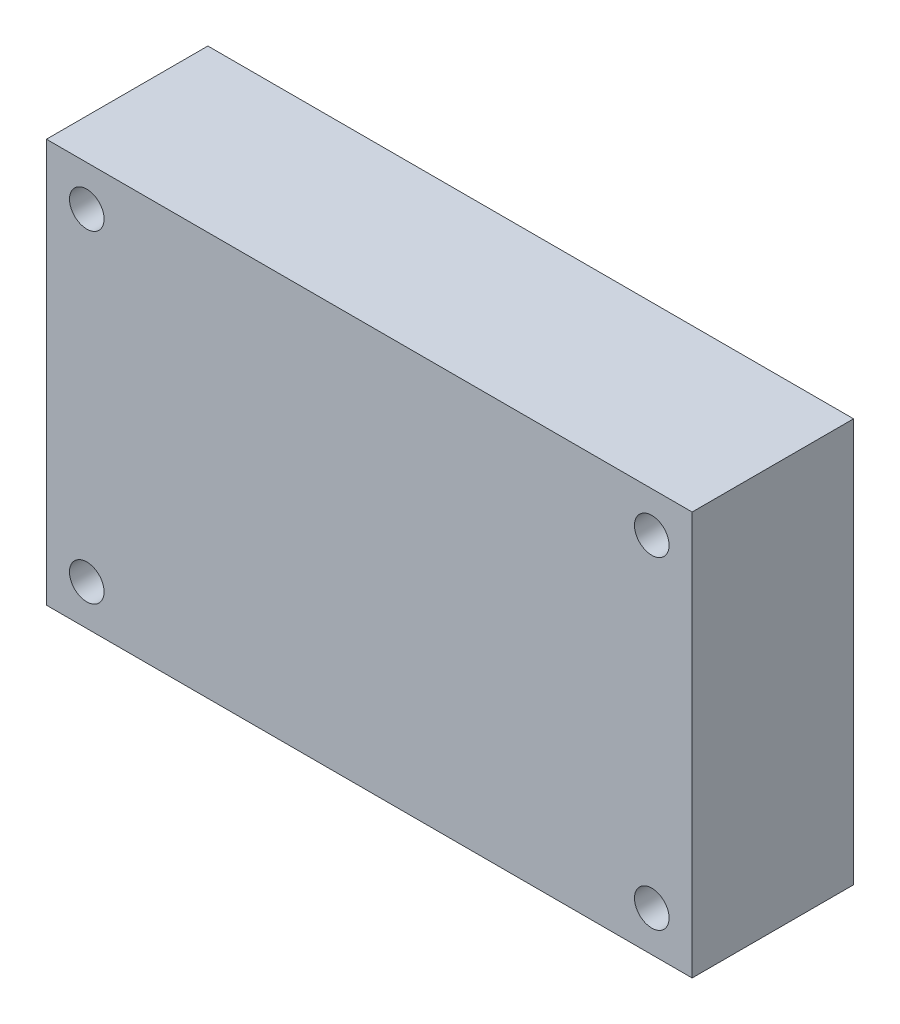
ISO-10303-21;
HEADER;
FILE_DESCRIPTION(('STEP AP214'),'2;1');
FILE_NAME('part.step','',(''),(''),'','','');
FILE_SCHEMA(('AUTOMOTIVE_DESIGN { 1 0 10303 214 1 1 1 1 }'));
ENDSEC;
DATA;
#1=APPLICATION_CONTEXT('core data for automotive mechanical design processes');
#2=APPLICATION_PROTOCOL_DEFINITION('international standard','automotive_design',2000,#1);
#3=PRODUCT_CONTEXT('',#1,'mechanical');
#4=PRODUCT('Part','Part','',(#3));
#5=PRODUCT_RELATED_PRODUCT_CATEGORY('part','',(#4));
#6=PRODUCT_DEFINITION_FORMATION('','',#4);
#7=PRODUCT_DEFINITION_CONTEXT('part definition',#1,'design');
#8=PRODUCT_DEFINITION('design','',#6,#7);
#9=PRODUCT_DEFINITION_SHAPE('','',#8);
#10=(LENGTH_UNIT() NAMED_UNIT(*) SI_UNIT(.MILLI.,.METRE.));
#11=(NAMED_UNIT(*) PLANE_ANGLE_UNIT() SI_UNIT($,.RADIAN.));
#12=(NAMED_UNIT(*) SI_UNIT($,.STERADIAN.) SOLID_ANGLE_UNIT());
#13=UNCERTAINTY_MEASURE_WITH_UNIT(LENGTH_MEASURE(1.E-05),#10,'distance_accuracy_value','');
#14=(GEOMETRIC_REPRESENTATION_CONTEXT(3) GLOBAL_UNCERTAINTY_ASSIGNED_CONTEXT((#13)) GLOBAL_UNIT_ASSIGNED_CONTEXT((#10,
#11,#12)) REPRESENTATION_CONTEXT('',''));
#15=CARTESIAN_POINT('',(0.,0.,0.));
#16=DIRECTION('',(0.,0.,1.));
#17=DIRECTION('',(1.,0.,0.));
#18=AXIS2_PLACEMENT_3D('',#15,#16,#17);
#19=CARTESIAN_POINT('',(0.,0.,14.));
#20=DIRECTION('',(1.,0.,0.));
#21=DIRECTION('',(0.,0.,-1.));
#22=AXIS2_PLACEMENT_3D('',#19,#20,#21);
#23=PLANE('',#22);
#24=DIRECTION('',(0.,-1.,0.));
#25=VECTOR('',#24,1.);
#26=CARTESIAN_POINT('',(0.,0.,0.));
#27=LINE('',#26,#25);
#28=CARTESIAN_POINT('',(0.,35.,0.));
#29=VERTEX_POINT('',#28);
#30=CARTESIAN_POINT('',(0.,0.,0.));
#31=VERTEX_POINT('',#30);
#32=EDGE_CURVE('E100',#29,#31,#27,.T.);
#33=ORIENTED_EDGE('',*,*,#32,.T.);
#34=DIRECTION('',(0.,0.,-1.));
#35=VECTOR('',#34,1.);
#36=CARTESIAN_POINT('',(0.,0.,14.));
#37=LINE('',#36,#35);
#38=CARTESIAN_POINT('',(0.,0.,14.));
#39=VERTEX_POINT('',#38);
#40=EDGE_CURVE('E11',#39,#31,#37,.T.);
#41=ORIENTED_EDGE('',*,*,#40,.F.);
#42=DIRECTION('',(0.,-1.,0.));
#43=VECTOR('',#42,1.);
#44=CARTESIAN_POINT('',(0.,0.,14.));
#45=LINE('',#44,#43);
#46=CARTESIAN_POINT('',(0.,35.,14.));
#47=VERTEX_POINT('',#46);
#48=EDGE_CURVE('E88',#47,#39,#45,.T.);
#49=ORIENTED_EDGE('',*,*,#48,.F.);
#50=DIRECTION('',(0.,0.,-1.));
#51=VECTOR('',#50,1.);
#52=CARTESIAN_POINT('',(0.,35.,14.));
#53=LINE('',#52,#51);
#54=EDGE_CURVE('E96',#47,#29,#53,.T.);
#55=ORIENTED_EDGE('',*,*,#54,.T.);
#56=EDGE_LOOP('',(#33,#41,#49,#55));
#57=FACE_BOUND('',#56,.T.);
#58=ADVANCED_FACE('F37',(#57),#23,.F.);
#59=CARTESIAN_POINT('',(0.,0.,14.));
#60=DIRECTION('',(0.,1.,0.));
#61=DIRECTION('',(0.,0.,1.));
#62=AXIS2_PLACEMENT_3D('',#59,#60,#61);
#63=PLANE('',#62);
#64=DIRECTION('',(1.,0.,0.));
#65=VECTOR('',#64,1.);
#66=CARTESIAN_POINT('',(0.,0.,0.));
#67=LINE('',#66,#65);
#68=CARTESIAN_POINT('',(56.,0.,0.));
#69=VERTEX_POINT('',#68);
#70=EDGE_CURVE('E92',#31,#69,#67,.T.);
#71=ORIENTED_EDGE('',*,*,#70,.T.);
#72=DIRECTION('',(0.,0.,-1.));
#73=VECTOR('',#72,1.);
#74=CARTESIAN_POINT('',(56.,0.,14.));
#75=LINE('',#74,#73);
#76=CARTESIAN_POINT('',(56.,0.,14.));
#77=VERTEX_POINT('',#76);
#78=EDGE_CURVE('E45',#77,#69,#75,.T.);
#79=ORIENTED_EDGE('',*,*,#78,.F.);
#80=DIRECTION('',(1.,0.,0.));
#81=VECTOR('',#80,1.);
#82=CARTESIAN_POINT('',(0.,0.,14.));
#83=LINE('',#82,#81);
#84=EDGE_CURVE('E83',#39,#77,#83,.T.);
#85=ORIENTED_EDGE('',*,*,#84,.F.);
#86=ORIENTED_EDGE('',*,*,#40,.T.);
#87=EDGE_LOOP('',(#71,#79,#85,#86));
#88=FACE_BOUND('',#87,.T.);
#89=ADVANCED_FACE('F91',(#88),#63,.F.);
#90=CARTESIAN_POINT('',(56.,0.,14.));
#91=DIRECTION('',(-1.,0.,0.));
#92=DIRECTION('',(0.,0.,1.));
#93=AXIS2_PLACEMENT_3D('',#90,#91,#92);
#94=PLANE('',#93);
#95=DIRECTION('',(0.,1.,0.));
#96=VECTOR('',#95,1.);
#97=CARTESIAN_POINT('',(56.,0.,0.));
#98=LINE('',#97,#96);
#99=CARTESIAN_POINT('',(56.,35.,0.));
#100=VERTEX_POINT('',#99);
#101=EDGE_CURVE('E70',#69,#100,#98,.T.);
#102=ORIENTED_EDGE('',*,*,#101,.T.);
#103=DIRECTION('',(0.,0.,-1.));
#104=VECTOR('',#103,1.);
#105=CARTESIAN_POINT('',(56.,35.,14.));
#106=LINE('',#105,#104);
#107=CARTESIAN_POINT('',(56.,35.,14.));
#108=VERTEX_POINT('',#107);
#109=EDGE_CURVE('E93',#108,#100,#106,.T.);
#110=ORIENTED_EDGE('',*,*,#109,.F.);
#111=DIRECTION('',(0.,1.,0.));
#112=VECTOR('',#111,1.);
#113=CARTESIAN_POINT('',(56.,0.,14.));
#114=LINE('',#113,#112);
#115=EDGE_CURVE('E86',#77,#108,#114,.T.);
#116=ORIENTED_EDGE('',*,*,#115,.F.);
#117=ORIENTED_EDGE('',*,*,#78,.T.);
#118=EDGE_LOOP('',(#102,#110,#116,#117));
#119=FACE_BOUND('',#118,.T.);
#120=ADVANCED_FACE('F94',(#119),#94,.F.);
#121=CARTESIAN_POINT('',(0.,35.,14.));
#122=DIRECTION('',(0.,-1.,0.));
#123=DIRECTION('',(0.,0.,-1.));
#124=AXIS2_PLACEMENT_3D('',#121,#122,#123);
#125=PLANE('',#124);
#126=DIRECTION('',(-1.,0.,0.));
#127=VECTOR('',#126,1.);
#128=CARTESIAN_POINT('',(0.,35.,0.));
#129=LINE('',#128,#127);
#130=EDGE_CURVE('E76',#100,#29,#129,.T.);
#131=ORIENTED_EDGE('',*,*,#130,.T.);
#132=ORIENTED_EDGE('',*,*,#54,.F.);
#133=DIRECTION('',(-1.,0.,0.));
#134=VECTOR('',#133,1.);
#135=CARTESIAN_POINT('',(0.,35.,14.));
#136=LINE('',#135,#134);
#137=EDGE_CURVE('E53',#108,#47,#136,.T.);
#138=ORIENTED_EDGE('',*,*,#137,.F.);
#139=ORIENTED_EDGE('',*,*,#109,.T.);
#140=EDGE_LOOP('',(#131,#132,#138,#139));
#141=FACE_BOUND('',#140,.T.);
#142=ADVANCED_FACE('F108',(#141),#125,.F.);
#143=CARTESIAN_POINT('',(0.,0.,14.));
#144=DIRECTION('',(0.,0.,-1.));
#145=DIRECTION('',(-1.,0.,0.));
#146=AXIS2_PLACEMENT_3D('',#143,#144,#145);
#147=PLANE('',#146);
#148=CARTESIAN_POINT('',(3.5,3.5,14.));
#149=DIRECTION('',(0.,0.,1.));
#150=DIRECTION('',(1.,0.,0.));
#151=AXIS2_PLACEMENT_3D('',#148,#149,#150);
#152=CIRCLE('',#151,1.5);
#153=CARTESIAN_POINT('',(5.,3.5,14.));
#154=VERTEX_POINT('',#153);
#155=EDGE_CURVE('E127',#154,#154,#152,.T.);
#156=ORIENTED_EDGE('',*,*,#155,.F.);
#157=EDGE_LOOP('',(#156));
#158=FACE_BOUND('',#157,.T.);
#159=CARTESIAN_POINT('',(52.5,31.5,14.));
#160=DIRECTION('',(0.,0.,1.));
#161=DIRECTION('',(1.,0.,0.));
#162=AXIS2_PLACEMENT_3D('',#159,#160,#161);
#163=CIRCLE('',#162,1.5);
#164=CARTESIAN_POINT('',(54.,31.5,14.));
#165=VERTEX_POINT('',#164);
#166=EDGE_CURVE('E120',#165,#165,#163,.T.);
#167=ORIENTED_EDGE('',*,*,#166,.F.);
#168=EDGE_LOOP('',(#167));
#169=FACE_BOUND('',#168,.T.);
#170=CARTESIAN_POINT('',(52.5,3.5,14.));
#171=DIRECTION('',(0.,0.,1.));
#172=DIRECTION('',(1.,0.,0.));
#173=AXIS2_PLACEMENT_3D('',#170,#171,#172);
#174=CIRCLE('',#173,1.5);
#175=CARTESIAN_POINT('',(54.,3.5,14.));
#176=VERTEX_POINT('',#175);
#177=EDGE_CURVE('E132',#176,#176,#174,.T.);
#178=ORIENTED_EDGE('',*,*,#177,.F.);
#179=EDGE_LOOP('',(#178));
#180=FACE_BOUND('',#179,.T.);
#181=CARTESIAN_POINT('',(3.5,31.5,14.));
#182=DIRECTION('',(0.,0.,1.));
#183=DIRECTION('',(1.,0.,0.));
#184=AXIS2_PLACEMENT_3D('',#181,#182,#183);
#185=CIRCLE('',#184,1.5);
#186=CARTESIAN_POINT('',(5.,31.5,14.));
#187=VERTEX_POINT('',#186);
#188=EDGE_CURVE('E114',#187,#187,#185,.T.);
#189=ORIENTED_EDGE('',*,*,#188,.F.);
#190=EDGE_LOOP('',(#189));
#191=FACE_BOUND('',#190,.T.);
#192=ORIENTED_EDGE('',*,*,#48,.T.);
#193=ORIENTED_EDGE('',*,*,#84,.T.);
#194=ORIENTED_EDGE('',*,*,#115,.T.);
#195=ORIENTED_EDGE('',*,*,#137,.T.);
#196=EDGE_LOOP('',(#192,#193,#194,#195));
#197=FACE_BOUND('',#196,.T.);
#198=ADVANCED_FACE('F84',(#158,#169,#180,#191,#197),#147,.F.);
#199=CARTESIAN_POINT('',(0.,0.,0.));
#200=DIRECTION('',(0.,0.,-1.));
#201=DIRECTION('',(-1.,0.,0.));
#202=AXIS2_PLACEMENT_3D('',#199,#200,#201);
#203=PLANE('',#202);
#204=ORIENTED_EDGE('',*,*,#32,.F.);
#205=ORIENTED_EDGE('',*,*,#130,.F.);
#206=ORIENTED_EDGE('',*,*,#101,.F.);
#207=ORIENTED_EDGE('',*,*,#70,.F.);
#208=EDGE_LOOP('',(#204,#205,#206,#207));
#209=FACE_BOUND('',#208,.T.);
#210=ADVANCED_FACE('F111',(#209),#203,.T.);
#211=CARTESIAN_POINT('',(3.5,31.5,4.));
#212=DIRECTION('',(0.,0.,1.));
#213=DIRECTION('',(1.,0.,0.));
#214=AXIS2_PLACEMENT_3D('',#211,#212,#213);
#215=CYLINDRICAL_SURFACE('',#214,1.5);
#216=CARTESIAN_POINT('',(3.5,31.5,4.));
#217=DIRECTION('',(0.,0.,1.));
#218=DIRECTION('',(1.,0.,0.));
#219=AXIS2_PLACEMENT_3D('',#216,#217,#218);
#220=CIRCLE('',#219,1.5);
#221=CARTESIAN_POINT('',(5.,31.5,4.));
#222=VERTEX_POINT('',#221);
#223=EDGE_CURVE('E103',#222,#222,#220,.T.);
#224=ORIENTED_EDGE('',*,*,#223,.F.);
#225=EDGE_LOOP('',(#224));
#226=FACE_BOUND('',#225,.T.);
#227=ORIENTED_EDGE('',*,*,#188,.T.);
#228=EDGE_LOOP('',(#227));
#229=FACE_BOUND('',#228,.T.);
#230=ADVANCED_FACE('F153',(#226,#229),#215,.F.);
#231=CARTESIAN_POINT('',(3.5,31.5,4.));
#232=DIRECTION('',(0.,0.,1.));
#233=DIRECTION('',(1.,0.,0.));
#234=AXIS2_PLACEMENT_3D('',#231,#232,#233);
#235=PLANE('',#234);
#236=ORIENTED_EDGE('',*,*,#223,.T.);
#237=EDGE_LOOP('',(#236));
#238=FACE_BOUND('',#237,.T.);
#239=ADVANCED_FACE('F143',(#238),#235,.T.);
#240=CARTESIAN_POINT('',(52.5,3.5,4.));
#241=DIRECTION('',(0.,0.,1.));
#242=DIRECTION('',(1.,0.,0.));
#243=AXIS2_PLACEMENT_3D('',#240,#241,#242);
#244=CYLINDRICAL_SURFACE('',#243,1.5);
#245=CARTESIAN_POINT('',(52.5,3.5,4.));
#246=DIRECTION('',(0.,0.,1.));
#247=DIRECTION('',(1.,0.,0.));
#248=AXIS2_PLACEMENT_3D('',#245,#246,#247);
#249=CIRCLE('',#248,1.5);
#250=CARTESIAN_POINT('',(54.,3.5,4.));
#251=VERTEX_POINT('',#250);
#252=EDGE_CURVE('E124',#251,#251,#249,.T.);
#253=ORIENTED_EDGE('',*,*,#252,.F.);
#254=EDGE_LOOP('',(#253));
#255=FACE_BOUND('',#254,.T.);
#256=ORIENTED_EDGE('',*,*,#177,.T.);
#257=EDGE_LOOP('',(#256));
#258=FACE_BOUND('',#257,.T.);
#259=ADVANCED_FACE('F140',(#255,#258),#244,.F.);
#260=CARTESIAN_POINT('',(52.5,3.5,4.));
#261=DIRECTION('',(0.,0.,1.));
#262=DIRECTION('',(1.,0.,0.));
#263=AXIS2_PLACEMENT_3D('',#260,#261,#262);
#264=PLANE('',#263);
#265=ORIENTED_EDGE('',*,*,#252,.T.);
#266=EDGE_LOOP('',(#265));
#267=FACE_BOUND('',#266,.T.);
#268=ADVANCED_FACE('F138',(#267),#264,.T.);
#269=CARTESIAN_POINT('',(52.5,31.5,4.));
#270=DIRECTION('',(0.,0.,1.));
#271=DIRECTION('',(1.,0.,0.));
#272=AXIS2_PLACEMENT_3D('',#269,#270,#271);
#273=CYLINDRICAL_SURFACE('',#272,1.5);
#274=CARTESIAN_POINT('',(52.5,31.5,4.));
#275=DIRECTION('',(0.,0.,1.));
#276=DIRECTION('',(1.,0.,0.));
#277=AXIS2_PLACEMENT_3D('',#274,#275,#276);
#278=CIRCLE('',#277,1.5);
#279=CARTESIAN_POINT('',(54.,31.5,4.));
#280=VERTEX_POINT('',#279);
#281=EDGE_CURVE('E123',#280,#280,#278,.T.);
#282=ORIENTED_EDGE('',*,*,#281,.F.);
#283=EDGE_LOOP('',(#282));
#284=FACE_BOUND('',#283,.T.);
#285=ORIENTED_EDGE('',*,*,#166,.T.);
#286=EDGE_LOOP('',(#285));
#287=FACE_BOUND('',#286,.T.);
#288=ADVANCED_FACE('F213',(#284,#287),#273,.F.);
#289=CARTESIAN_POINT('',(52.5,31.5,4.));
#290=DIRECTION('',(0.,0.,1.));
#291=DIRECTION('',(1.,0.,0.));
#292=AXIS2_PLACEMENT_3D('',#289,#290,#291);
#293=PLANE('',#292);
#294=ORIENTED_EDGE('',*,*,#281,.T.);
#295=EDGE_LOOP('',(#294));
#296=FACE_BOUND('',#295,.T.);
#297=ADVANCED_FACE('F221',(#296),#293,.T.);
#298=CARTESIAN_POINT('',(3.5,3.5,4.));
#299=DIRECTION('',(0.,0.,1.));
#300=DIRECTION('',(1.,0.,0.));
#301=AXIS2_PLACEMENT_3D('',#298,#299,#300);
#302=CYLINDRICAL_SURFACE('',#301,1.5);
#303=CARTESIAN_POINT('',(3.5,3.5,4.));
#304=DIRECTION('',(0.,0.,1.));
#305=DIRECTION('',(1.,0.,0.));
#306=AXIS2_PLACEMENT_3D('',#303,#304,#305);
#307=CIRCLE('',#306,1.5);
#308=CARTESIAN_POINT('',(5.,3.5,4.));
#309=VERTEX_POINT('',#308);
#310=EDGE_CURVE('E117',#309,#309,#307,.T.);
#311=ORIENTED_EDGE('',*,*,#310,.F.);
#312=EDGE_LOOP('',(#311));
#313=FACE_BOUND('',#312,.T.);
#314=ORIENTED_EDGE('',*,*,#155,.T.);
#315=EDGE_LOOP('',(#314));
#316=FACE_BOUND('',#315,.T.);
#317=ADVANCED_FACE('F230',(#313,#316),#302,.F.);
#318=CARTESIAN_POINT('',(3.5,3.5,4.));
#319=DIRECTION('',(0.,0.,1.));
#320=DIRECTION('',(1.,0.,0.));
#321=AXIS2_PLACEMENT_3D('',#318,#319,#320);
#322=PLANE('',#321);
#323=ORIENTED_EDGE('',*,*,#310,.T.);
#324=EDGE_LOOP('',(#323));
#325=FACE_BOUND('',#324,.T.);
#326=ADVANCED_FACE('F239',(#325),#322,.T.);
#327=CLOSED_SHELL('',(#58,#89,#120,#142,#198,#210,#230,#239,#259,#268,#288,#297,#317,#326));
#328=MANIFOLD_SOLID_BREP('B2',#327);
#329=ADVANCED_BREP_SHAPE_REPRESENTATION('',(#18,#328),#14);
#330=SHAPE_DEFINITION_REPRESENTATION(#9,#329);
ENDSEC;
END-ISO-10303-21;
